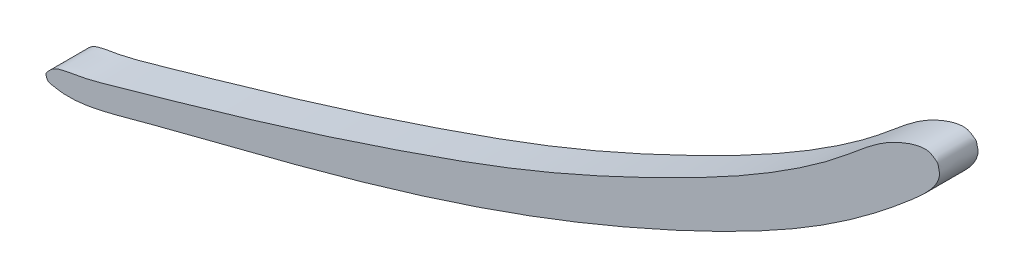
ISO-10303-21;
HEADER;
FILE_DESCRIPTION(('STEP AP214'),'2;1');
FILE_NAME('part.step','',(''),(''),'','','');
FILE_SCHEMA(('AUTOMOTIVE_DESIGN { 1 0 10303 214 1 1 1 1 }'));
ENDSEC;
DATA;
#1=APPLICATION_CONTEXT('core data for automotive mechanical design processes');
#2=APPLICATION_PROTOCOL_DEFINITION('international standard','automotive_design',2000,#1);
#3=PRODUCT_CONTEXT('',#1,'mechanical');
#4=PRODUCT('Part','Part','',(#3));
#5=PRODUCT_RELATED_PRODUCT_CATEGORY('part','',(#4));
#6=PRODUCT_DEFINITION_FORMATION('','',#4);
#7=PRODUCT_DEFINITION_CONTEXT('part definition',#1,'design');
#8=PRODUCT_DEFINITION('design','',#6,#7);
#9=PRODUCT_DEFINITION_SHAPE('','',#8);
#10=(LENGTH_UNIT() NAMED_UNIT(*) SI_UNIT(.MILLI.,.METRE.));
#11=(NAMED_UNIT(*) PLANE_ANGLE_UNIT() SI_UNIT($,.RADIAN.));
#12=(NAMED_UNIT(*) SI_UNIT($,.STERADIAN.) SOLID_ANGLE_UNIT());
#13=UNCERTAINTY_MEASURE_WITH_UNIT(LENGTH_MEASURE(1.E-05),#10,'distance_accuracy_value','');
#14=(GEOMETRIC_REPRESENTATION_CONTEXT(3) GLOBAL_UNCERTAINTY_ASSIGNED_CONTEXT((#13)) GLOBAL_UNIT_ASSIGNED_CONTEXT((#10,
#11,#12)) REPRESENTATION_CONTEXT('',''));
#15=CARTESIAN_POINT('',(0.,0.,0.));
#16=DIRECTION('',(0.,0.,1.));
#17=DIRECTION('',(1.,0.,0.));
#18=AXIS2_PLACEMENT_3D('',#15,#16,#17);
#19=CARTESIAN_POINT('',(99.1390527456377,0.,196.));
#20=CARTESIAN_POINT('',(99.0705381631852,0.12114842121631,196.));
#21=CARTESIAN_POINT('',(98.9619814801963,0.208303228285212,196.));
#22=CARTESIAN_POINT('',(98.7399154595745,0.369764675328481,196.));
#23=CARTESIAN_POINT('',(98.624108676656,0.443504908716316,196.));
#24=CARTESIAN_POINT('',(98.3964853926266,0.596828558211323,196.));
#25=CARTESIAN_POINT('',(98.2839347386924,0.675336915138092,196.));
#26=CARTESIAN_POINT('',(98.0526568526752,0.823308935798146,196.));
#27=CARTESIAN_POINT('',(97.9345351292171,0.893015556493898,196.));
#28=CARTESIAN_POINT('',(97.6931861612355,1.01937408990707,196.));
#29=CARTESIAN_POINT('',(97.569507067258,1.07560390277591,196.));
#30=CARTESIAN_POINT('',(97.3115513561695,1.16355219488391,196.));
#31=CARTESIAN_POINT('',(97.1763577467144,1.19641035513029,196.));
#32=CARTESIAN_POINT('',(96.7692919205939,1.26371098249381,196.));
#33=CARTESIAN_POINT('',(96.4967654804414,1.26860631216469,196.));
#34=CARTESIAN_POINT('',(95.950603160296,1.23980892738743,196.));
#35=CARTESIAN_POINT('',(95.6771313417599,1.20480864364403,196.));
#36=CARTESIAN_POINT('',(95.1393731928511,1.11616671398045,196.));
#37=CARTESIAN_POINT('',(94.8734792276293,1.06115150027265,196.));
#38=CARTESIAN_POINT('',(94.0836511693327,0.867969236698684,196.));
#39=CARTESIAN_POINT('',(93.5667488191588,0.704610743989481,196.));
#40=CARTESIAN_POINT('',(92.542217090791,0.34467304118778,196.));
#41=CARTESIAN_POINT('',(92.0338038993851,0.14481238472664,196.));
#42=CARTESIAN_POINT('',(91.0360529469735,-0.284285824685628,196.));
#43=CARTESIAN_POINT('',(90.5460392138195,-0.513071069627938,196.));
#44=CARTESIAN_POINT('',(89.101274263539,-1.24003238576061,196.));
#45=CARTESIAN_POINT('',(88.1727487226702,-1.78033926607219,196.));
#46=CARTESIAN_POINT('',(85.4849631288059,-3.55835843614376,196.));
#47=CARTESIAN_POINT('',(83.8137071878982,-4.93775343414661,196.));
#48=CARTESIAN_POINT('',(81.3165033570506,-7.02091526129579,196.));
#49=CARTESIAN_POINT('',(80.4840293975594,-7.71518929007293,196.));
#50=CARTESIAN_POINT('',(78.8050907139602,-9.08193828522647,196.));
#51=CARTESIAN_POINT('',(77.9593084637942,-9.75547661679078,196.));
#52=CARTESIAN_POINT('',(75.3912480991203,-11.7282366149688,196.));
#53=CARTESIAN_POINT('',(73.6410011668217,-12.983879962527,196.));
#54=CARTESIAN_POINT('',(70.091070959762,-15.4181397085281,196.));
#55=CARTESIAN_POINT('',(68.2912330143441,-16.5965151140455,196.));
#56=CARTESIAN_POINT('',(64.6538840653597,-18.8945673930191,196.));
#57=CARTESIAN_POINT('',(62.8148714639161,-20.0119046212365,196.));
#58=CARTESIAN_POINT('',(59.0983398267091,-22.1865820590974,196.));
#59=CARTESIAN_POINT('',(57.2215068059374,-23.2449911512517,196.));
#60=CARTESIAN_POINT('',(51.5477885914854,-26.3528785059766,196.));
#61=CARTESIAN_POINT('',(47.7078362833754,-28.3395620982058,196.));
#62=CARTESIAN_POINT('',(39.9704116625386,-32.2014203960084,196.));
#63=CARTESIAN_POINT('',(36.07175895946,-34.0730896522607,196.));
#64=CARTESIAN_POINT('',(28.2282382588944,-37.7117112154659,196.));
#65=CARTESIAN_POINT('',(24.2831999523126,-39.4789454757029,196.));
#66=CARTESIAN_POINT('',(16.3311017318914,-42.8746617142314,196.));
#67=CARTESIAN_POINT('',(12.3226136651517,-44.4990218988497,196.));
#68=CARTESIAN_POINT('',(4.25407820091335,-47.6041216910327,196.));
#69=CARTESIAN_POINT('',(0.193277896843264,-49.087044755674,196.));
#70=CARTESIAN_POINT('',(-7.95876247908037,-51.9726915325784,196.));
#71=CARTESIAN_POINT('',(-12.0470373785053,-53.3777358293024,196.));
#72=CARTESIAN_POINT('',(-20.2405974680925,-56.1353847275332,196.));
#73=CARTESIAN_POINT('',(-24.3468333136639,-57.4850586278146,196.));
#74=CARTESIAN_POINT('',(-32.5822485751242,-60.1136754894888,196.));
#75=CARTESIAN_POINT('',(-36.711752069253,-61.3916193754162,196.));
#76=CARTESIAN_POINT('',(-44.9902753472216,-63.8873419037721,196.));
#77=CARTESIAN_POINT('',(-49.1392940112702,-65.1050506920413,196.));
#78=CARTESIAN_POINT('',(-57.4434927727543,-67.5174173644484,196.));
#79=CARTESIAN_POINT('',(-61.5983277144829,-68.7141888448641,196.));
#80=CARTESIAN_POINT('',(-67.8337015245685,-70.4984167585606,196.));
#81=CARTESIAN_POINT('',(-69.9138974307907,-71.0870574885458,196.));
#82=CARTESIAN_POINT('',(-73.0365456983735,-71.961630498518,196.));
#83=CARTESIAN_POINT('',(-74.0768711260842,-72.2552535790516,196.));
#84=CARTESIAN_POINT('',(-76.1668281081147,-72.8074554377176,196.));
#85=CARTESIAN_POINT('',(-77.2179219237216,-73.0634705520785,196.));
#86=CARTESIAN_POINT('',(-78.8051420355843,-73.3939022545884,196.));
#87=CARTESIAN_POINT('',(-79.3358199574373,-73.4958058998055,196.));
#88=CARTESIAN_POINT('',(-80.4010711833489,-73.67960825399,196.));
#89=CARTESIAN_POINT('',(-80.935565790124,-73.7619111169165,196.));
#90=CARTESIAN_POINT('',(-81.9985156680065,-73.957532162614,196.));
#91=CARTESIAN_POINT('',(-82.5294971661545,-74.0694122656019,196.));
#92=CARTESIAN_POINT('',(-83.3040714902985,-74.2997558407684,196.));
#93=CARTESIAN_POINT('',(-83.5581101049905,-74.3879330801455,196.));
#94=CARTESIAN_POINT('',(-84.0517784498691,-74.6038279362769,196.));
#95=CARTESIAN_POINT('',(-84.2942373366876,-74.7338938915089,196.));
#96=CARTESIAN_POINT('',(-84.7337591393474,-75.0412996320327,196.));
#97=CARTESIAN_POINT('',(-84.9323319447844,-75.2187797200819,196.));
#98=CARTESIAN_POINT('',(-85.2132597996393,-75.5040001661479,196.));
#99=CARTESIAN_POINT('',(-85.3032311313982,-75.6031935549199,196.));
#100=CARTESIAN_POINT('',(-85.4819066589854,-75.8030023086123,196.));
#101=CARTESIAN_POINT('',(-85.5721858265093,-75.9026831746521,196.));
#102=CARTESIAN_POINT('',(-85.7384185263666,-76.1136617096411,196.));
#103=CARTESIAN_POINT('',(-85.8181501553151,-76.2253931021202,196.));
#104=CARTESIAN_POINT('',(-85.8959875603976,-76.4823478983223,196.));
#105=CARTESIAN_POINT('',(-85.8838544768175,-76.6219416732892,196.));
#106=CARTESIAN_POINT('',(-85.8195481192338,-76.8799306936679,196.));
#107=CARTESIAN_POINT('',(-85.7718407926133,-77.0040099671569,196.));
#108=CARTESIAN_POINT('',(-85.6655806368412,-77.2487412474883,196.));
#109=CARTESIAN_POINT('',(-85.6060904367487,-77.3696380103478,196.));
#110=CARTESIAN_POINT('',(-85.4804758142897,-77.525162716289,196.));
#111=CARTESIAN_POINT('',(-85.4324612072422,-77.5709451881218,196.));
#112=CARTESIAN_POINT('',(-85.3223635592061,-77.6478480762519,196.));
#113=CARTESIAN_POINT('',(-85.2626454776153,-77.6763087892865,196.));
#114=CARTESIAN_POINT('',(-85.0730340999229,-77.7393159789,196.));
#115=CARTESIAN_POINT('',(-84.9397110854538,-77.7557756264946,196.));
#116=CARTESIAN_POINT('',(-84.6761572344224,-77.7933237523743,196.));
#117=CARTESIAN_POINT('',(-84.5446099124298,-77.8134119438837,196.));
#118=CARTESIAN_POINT('',(-84.2827300644167,-77.8605411735858,196.));
#119=CARTESIAN_POINT('',(-84.1521300760299,-77.8859759616051,196.));
#120=CARTESIAN_POINT('',(-83.7603512343996,-77.9641713424472,196.));
#121=CARTESIAN_POINT('',(-83.4994279488752,-78.0194223044581,196.));
#122=CARTESIAN_POINT('',(-82.975670370277,-78.1072148044492,196.));
#123=CARTESIAN_POINT('',(-82.712825340275,-78.1396287503346,196.));
#124=CARTESIAN_POINT('',(-81.9217957387907,-78.2072271054569,196.));
#125=CARTESIAN_POINT('',(-81.391364946854,-78.2157185941008,196.));
#126=CARTESIAN_POINT('',(-80.327382457623,-78.1956143483966,196.));
#127=CARTESIAN_POINT('',(-79.7945140382825,-78.1665778248105,196.));
#128=CARTESIAN_POINT('',(-78.2112678098264,-78.0298553749989,196.));
#129=CARTESIAN_POINT('',(-77.1696786637489,-77.8703442286823,196.));
#130=CARTESIAN_POINT('',(-75.1027178644574,-77.4716090436837,196.));
#131=CARTESIAN_POINT('',(-74.076607646553,-77.2360152287475,196.));
#132=CARTESIAN_POINT('',(-72.0304639727079,-76.734958846878,196.));
#133=CARTESIAN_POINT('',(-71.010738012545,-76.4679848639671,196.));
#134=CARTESIAN_POINT('',(-68.9728808647812,-75.9261982060217,196.));
#135=CARTESIAN_POINT('',(-67.9550201554657,-75.6500346928756,196.));
#136=CARTESIAN_POINT('',(-65.9191599858734,-75.0987063008929,196.));
#137=CARTESIAN_POINT('',(-64.9009765795865,-74.8239846915873,196.));
#138=CARTESIAN_POINT('',(-61.8447553760793,-74.006037448587,196.));
#139=CARTESIAN_POINT('',(-59.8049142915801,-73.4695599449064,196.));
#140=CARTESIAN_POINT('',(-53.6794030174537,-71.8833326051825,196.));
#141=CARTESIAN_POINT('',(-49.588715422538,-70.8530089512087,196.));
#142=CARTESIAN_POINT('',(-41.4129848879707,-68.7707410110824,196.));
#143=CARTESIAN_POINT('',(-37.328060964298,-67.7183815568026,196.));
#144=CARTESIAN_POINT('',(-25.0987773220444,-64.4640290822007,196.));
#145=CARTESIAN_POINT('',(-16.9788494305306,-62.1689108374777,196.));
#146=CARTESIAN_POINT('',(-4.8907527487675,-58.4277005032172,196.));
#147=CARTESIAN_POINT('',(-0.875192203285054,-57.1315028451246,196.));
#148=CARTESIAN_POINT('',(7.11681195923092,-54.43187399364,196.));
#149=CARTESIAN_POINT('',(11.0934236767179,-53.0275468678937,196.));
#150=CARTESIAN_POINT('',(19.002410468593,-50.0945288405134,196.));
#151=CARTESIAN_POINT('',(22.9357583416552,-48.5655322417936,196.));
#152=CARTESIAN_POINT('',(30.7512535666687,-45.3911335824992,196.));
#153=CARTESIAN_POINT('',(34.6344408099337,-43.7459642942875,196.));
#154=CARTESIAN_POINT('',(42.3529038734393,-40.3425401538769,196.));
#155=CARTESIAN_POINT('',(46.1894902005361,-38.5847794010589,196.));
#156=CARTESIAN_POINT('',(53.7993693987408,-34.9460318210761,196.));
#157=CARTESIAN_POINT('',(57.5737071667001,-33.0649922064886,196.));
#158=CARTESIAN_POINT('',(65.0323636187695,-29.1215153018294,196.));
#159=CARTESIAN_POINT('',(68.7154629660053,-27.0596454831483,196.));
#160=CARTESIAN_POINT('',(75.918812287159,-22.6714074972758,196.));
#161=CARTESIAN_POINT('',(79.4422711321468,-20.3415132241054,196.));
#162=CARTESIAN_POINT('',(84.5644604250133,-16.6245679134496,196.));
#163=CARTESIAN_POINT('',(86.2462353260359,-15.348400505252,196.));
#164=CARTESIAN_POINT('',(89.5581059611734,-12.7329346197097,196.));
#165=CARTESIAN_POINT('',(91.190370310954,-11.3945683109664,196.));
#166=CARTESIAN_POINT('',(93.6026215180454,-9.34496116060237,196.));
#167=CARTESIAN_POINT('',(94.4011654331405,-8.65467628292653,196.));
#168=CARTESIAN_POINT('',(95.5743322114551,-7.59262629573988,196.));
#169=CARTESIAN_POINT('',(95.9602238956857,-7.23301822058665,196.));
#170=CARTESIAN_POINT('',(96.7151387980152,-6.49553711535625,196.));
#171=CARTESIAN_POINT('',(97.0846770702119,-6.1185552542365,196.));
#172=CARTESIAN_POINT('',(97.7842309875143,-5.33409030799211,196.));
#173=CARTESIAN_POINT('',(98.1149767105655,-4.92647198479069,196.));
#174=CARTESIAN_POINT('',(98.7109180534272,-4.05824119327147,196.));
#175=CARTESIAN_POINT('',(98.9749452665146,-3.59233197633501,196.));
#176=CARTESIAN_POINT('',(99.2757124496296,-2.85982825629263,196.));
#177=CARTESIAN_POINT('',(99.3614013282433,-2.60791126710274,196.));
#178=CARTESIAN_POINT('',(99.4779077142938,-2.08838729306765,196.));
#179=CARTESIAN_POINT('',(99.5091263191373,-1.82606607562914,196.));
#180=CARTESIAN_POINT('',(99.4713434581012,-1.29193630356552,196.));
#181=CARTESIAN_POINT('',(99.4007865184433,-1.03239406316814,196.));
#182=CARTESIAN_POINT('',(99.3036967444727,-0.643535638108471,196.));
#183=CARTESIAN_POINT('',(99.2771704282177,-0.512710773333086,196.));
#184=CARTESIAN_POINT('',(99.2390282127249,-0.31613329991335,196.));
#185=CARTESIAN_POINT('',(99.2268179408858,-0.250371013732544,196.));
#186=CARTESIAN_POINT('',(99.1936447923037,-0.121709051484964,196.));
#187=CARTESIAN_POINT('',(99.1733100368639,-0.0605742106081461,196.));
#188=CARTESIAN_POINT('',(99.1390527456377,0.,196.));
#189=B_SPLINE_CURVE_WITH_KNOTS('',3,(#19,#20,#21,#22,#23,#24,#25,#26,#27,#28,#29,#30,#31,#32,
#33,#34,#35,#36,#37,#38,#39,#40,#41,#42,#43,#44,#45,#46,#47,#48,#49,#50,#51,#52,#53,#54,#55,#56,
#57,#58,#59,#60,#61,#62,#63,#64,#65,#66,#67,#68,#69,#70,#71,#72,#73,#74,#75,#76,#77,#78,#79,#80,
#81,#82,#83,#84,#85,#86,#87,#88,#89,#90,#91,#92,#93,#94,#95,#96,#97,#98,#99,#100,#101,#102,#103,
#104,#105,#106,#107,#108,#109,#110,#111,#112,#113,#114,#115,#116,#117,#118,#119,#120,#121,#122,
#123,#124,#125,#126,#127,#128,#129,#130,#131,#132,#133,#134,#135,#136,#137,#138,#139,#140,#141,
#142,#143,#144,#145,#146,#147,#148,#149,#150,#151,#152,#153,#154,#155,#156,#157,#158,#159,#160,
#161,#162,#163,#164,#165,#166,#167,#168,#169,#170,#171,#172,#173,#174,#175,#176,#177,#178,#179,
#180,#181,#182,#183,#184,#185,#186,#187,#188),.UNSPECIFIED.,.T.,.F.,(4,2,2,2,2,2,2,2,2,2,2,2,2,
2,2,2,2,2,2,2,2,2,2,2,2,2,2,2,2,2,2,2,2,2,2,2,2,2,2,2,2,2,2,2,2,2,2,2,2,2,2,2,2,2,2,2,2,2,2,2,2,
2,2,2,2,2,2,2,2,2,2,2,2,2,2,2,2,2,2,2,2,2,2,2,4),(0.,0.000976562499999962,0.00195312499999992,
0.00292968749999989,0.00390624999999985,0.00488281249999981,0.00585937499999977,
0.0078124999999998,0.00976562499999982,0.0117187499999998,0.015625,0.0195312500000001,
0.0234375000000003,0.0312500000000005,0.0468750000000008,0.054687500000001,0.0625000000000012,
0.0781250000000017,0.0937500000000021,0.109375000000003,0.125000000000003,0.156250000000004,
0.187500000000005,0.218750000000006,0.250000000000006,0.281250000000007,0.312500000000008,
0.343750000000009,0.37500000000001,0.406250000000011,0.437500000000012,0.453125000000012,
0.460937500000012,0.468750000000012,0.472656250000013,0.476562500000013,0.480468750000013,
0.482421875000013,0.484375000000013,0.486328125000013,0.487304687500013,0.488281250000013,
0.489257812500013,0.490234375000013,0.491210937500013,0.492187500000013,0.492675781250013,
0.493164062500013,0.494140625000013,0.495117187500013,0.496093750000014,0.498046875000013,
0.500000000000013,0.503906250000013,0.507812500000013,0.515625000000013,0.523437500000013,
0.531250000000013,0.539062500000012,0.546875000000012,0.562500000000012,0.593750000000011,
0.62500000000001,0.687500000000008,0.718750000000007,0.750000000000006,0.781250000000005,
0.812500000000004,0.843750000000004,0.875000000000003,0.906250000000002,0.937500000000001,
0.953125000000001,0.96875,0.9765625,0.98046875,0.984375,0.98828125,0.9921875,0.994140625,
0.99609375,0.998046875,0.9990234375,0.99951171875,1.),.UNSPECIFIED.);
#190=DIRECTION('',(0.,0.,-1.));
#191=VECTOR('',#190,1.);
#192=SURFACE_OF_LINEAR_EXTRUSION('',#189,#191);
#193=CARTESIAN_POINT('',(99.1390527456377,0.,196.));
#194=CARTESIAN_POINT('',(99.1733100368639,-0.0605742106081461,196.));
#195=CARTESIAN_POINT('',(99.1936447923037,-0.121709051484964,196.));
#196=CARTESIAN_POINT('',(99.2268179408858,-0.250371013732544,196.));
#197=CARTESIAN_POINT('',(99.2390282127249,-0.31613329991335,196.));
#198=CARTESIAN_POINT('',(99.2771704282177,-0.512710773333086,196.));
#199=CARTESIAN_POINT('',(99.3036967444727,-0.643535638108471,196.));
#200=CARTESIAN_POINT('',(99.4007865184433,-1.03239406316814,196.));
#201=CARTESIAN_POINT('',(99.4713434581012,-1.29193630356552,196.));
#202=CARTESIAN_POINT('',(99.5091263191373,-1.82606607562914,196.));
#203=CARTESIAN_POINT('',(99.4779077142938,-2.08838729306765,196.));
#204=CARTESIAN_POINT('',(99.3614013282433,-2.60791126710274,196.));
#205=CARTESIAN_POINT('',(99.2757124496296,-2.85982825629263,196.));
#206=CARTESIAN_POINT('',(98.9749452665146,-3.59233197633501,196.));
#207=CARTESIAN_POINT('',(98.7109180534272,-4.05824119327147,196.));
#208=CARTESIAN_POINT('',(98.1149767105655,-4.92647198479069,196.));
#209=CARTESIAN_POINT('',(97.7842309875143,-5.33409030799211,196.));
#210=CARTESIAN_POINT('',(97.0846770702119,-6.1185552542365,196.));
#211=CARTESIAN_POINT('',(96.7151387980152,-6.49553711535625,196.));
#212=CARTESIAN_POINT('',(95.9602238956857,-7.23301822058665,196.));
#213=CARTESIAN_POINT('',(95.5743322114551,-7.59262629573988,196.));
#214=CARTESIAN_POINT('',(94.4011654331405,-8.65467628292653,196.));
#215=CARTESIAN_POINT('',(93.6026215180454,-9.34496116060237,196.));
#216=CARTESIAN_POINT('',(91.190370310954,-11.3945683109664,196.));
#217=CARTESIAN_POINT('',(89.5581059611734,-12.7329346197097,196.));
#218=CARTESIAN_POINT('',(86.2462353260359,-15.348400505252,196.));
#219=CARTESIAN_POINT('',(84.5644604250133,-16.6245679134496,196.));
#220=CARTESIAN_POINT('',(79.4422711321468,-20.3415132241054,196.));
#221=CARTESIAN_POINT('',(75.918812287159,-22.6714074972758,196.));
#222=CARTESIAN_POINT('',(68.7154629660053,-27.0596454831483,196.));
#223=CARTESIAN_POINT('',(65.0323636187695,-29.1215153018294,196.));
#224=CARTESIAN_POINT('',(57.5737071667001,-33.0649922064886,196.));
#225=CARTESIAN_POINT('',(53.7993693987408,-34.9460318210761,196.));
#226=CARTESIAN_POINT('',(46.1894902005361,-38.5847794010589,196.));
#227=CARTESIAN_POINT('',(42.3529038734393,-40.3425401538769,196.));
#228=CARTESIAN_POINT('',(34.6344408099337,-43.7459642942875,196.));
#229=CARTESIAN_POINT('',(30.7512535666687,-45.3911335824992,196.));
#230=CARTESIAN_POINT('',(22.9357583416552,-48.5655322417936,196.));
#231=CARTESIAN_POINT('',(19.002410468593,-50.0945288405134,196.));
#232=CARTESIAN_POINT('',(11.0934236767179,-53.0275468678937,196.));
#233=CARTESIAN_POINT('',(7.11681195923092,-54.43187399364,196.));
#234=CARTESIAN_POINT('',(-0.875192203285054,-57.1315028451246,196.));
#235=CARTESIAN_POINT('',(-4.8907527487675,-58.4277005032172,196.));
#236=CARTESIAN_POINT('',(-16.9788494305306,-62.1689108374777,196.));
#237=CARTESIAN_POINT('',(-25.0987773220444,-64.4640290822007,196.));
#238=CARTESIAN_POINT('',(-37.328060964298,-67.7183815568026,196.));
#239=CARTESIAN_POINT('',(-41.4129848879707,-68.7707410110824,196.));
#240=CARTESIAN_POINT('',(-49.588715422538,-70.8530089512087,196.));
#241=CARTESIAN_POINT('',(-53.6794030174537,-71.8833326051825,196.));
#242=CARTESIAN_POINT('',(-59.8049142915801,-73.4695599449064,196.));
#243=CARTESIAN_POINT('',(-61.8447553760793,-74.006037448587,196.));
#244=CARTESIAN_POINT('',(-64.9009765795865,-74.8239846915873,196.));
#245=CARTESIAN_POINT('',(-65.9191599858734,-75.0987063008929,196.));
#246=CARTESIAN_POINT('',(-67.9550201554657,-75.6500346928756,196.));
#247=CARTESIAN_POINT('',(-68.9728808647812,-75.9261982060217,196.));
#248=CARTESIAN_POINT('',(-71.010738012545,-76.4679848639671,196.));
#249=CARTESIAN_POINT('',(-72.0304639727079,-76.734958846878,196.));
#250=CARTESIAN_POINT('',(-74.076607646553,-77.2360152287475,196.));
#251=CARTESIAN_POINT('',(-75.1027178644574,-77.4716090436837,196.));
#252=CARTESIAN_POINT('',(-77.1696786637489,-77.8703442286823,196.));
#253=CARTESIAN_POINT('',(-78.2112678098264,-78.0298553749989,196.));
#254=CARTESIAN_POINT('',(-79.7945140382825,-78.1665778248105,196.));
#255=CARTESIAN_POINT('',(-80.327382457623,-78.1956143483966,196.));
#256=CARTESIAN_POINT('',(-81.391364946854,-78.2157185941008,196.));
#257=CARTESIAN_POINT('',(-81.9217957387907,-78.2072271054569,196.));
#258=CARTESIAN_POINT('',(-82.712825340275,-78.1396287503346,196.));
#259=CARTESIAN_POINT('',(-82.975670370277,-78.1072148044492,196.));
#260=CARTESIAN_POINT('',(-83.4994279488752,-78.0194223044581,196.));
#261=CARTESIAN_POINT('',(-83.7603512343996,-77.9641713424472,196.));
#262=CARTESIAN_POINT('',(-84.1521300760299,-77.8859759616051,196.));
#263=CARTESIAN_POINT('',(-84.2827300644167,-77.8605411735858,196.));
#264=CARTESIAN_POINT('',(-84.5446099124298,-77.8134119438837,196.));
#265=CARTESIAN_POINT('',(-84.6761572344224,-77.7933237523743,196.));
#266=CARTESIAN_POINT('',(-84.9397110854538,-77.7557756264946,196.));
#267=CARTESIAN_POINT('',(-85.0730340999229,-77.7393159789,196.));
#268=CARTESIAN_POINT('',(-85.2626454776153,-77.6763087892865,196.));
#269=CARTESIAN_POINT('',(-85.3223635592061,-77.6478480762519,196.));
#270=CARTESIAN_POINT('',(-85.4324612072422,-77.5709451881218,196.));
#271=CARTESIAN_POINT('',(-85.4804758142897,-77.525162716289,196.));
#272=CARTESIAN_POINT('',(-85.6060904367487,-77.3696380103478,196.));
#273=CARTESIAN_POINT('',(-85.6655806368412,-77.2487412474883,196.));
#274=CARTESIAN_POINT('',(-85.7718407926133,-77.0040099671569,196.));
#275=CARTESIAN_POINT('',(-85.8195481192338,-76.8799306936679,196.));
#276=CARTESIAN_POINT('',(-85.8838544768175,-76.6219416732892,196.));
#277=CARTESIAN_POINT('',(-85.8959875603976,-76.4823478983223,196.));
#278=CARTESIAN_POINT('',(-85.8181501553151,-76.2253931021202,196.));
#279=CARTESIAN_POINT('',(-85.7384185263666,-76.1136617096411,196.));
#280=CARTESIAN_POINT('',(-85.5721858265093,-75.9026831746521,196.));
#281=CARTESIAN_POINT('',(-85.4819066589854,-75.8030023086123,196.));
#282=CARTESIAN_POINT('',(-85.3032311313982,-75.6031935549199,196.));
#283=CARTESIAN_POINT('',(-85.2132597996393,-75.5040001661479,196.));
#284=CARTESIAN_POINT('',(-84.9323319447844,-75.2187797200819,196.));
#285=CARTESIAN_POINT('',(-84.7337591393474,-75.0412996320327,196.));
#286=CARTESIAN_POINT('',(-84.2942373366876,-74.7338938915089,196.));
#287=CARTESIAN_POINT('',(-84.0517784498691,-74.6038279362769,196.));
#288=CARTESIAN_POINT('',(-83.5581101049905,-74.3879330801455,196.));
#289=CARTESIAN_POINT('',(-83.3040714902985,-74.2997558407684,196.));
#290=CARTESIAN_POINT('',(-82.5294971661545,-74.0694122656019,196.));
#291=CARTESIAN_POINT('',(-81.9985156680065,-73.957532162614,196.));
#292=CARTESIAN_POINT('',(-80.935565790124,-73.7619111169165,196.));
#293=CARTESIAN_POINT('',(-80.4010711833489,-73.67960825399,196.));
#294=CARTESIAN_POINT('',(-79.3358199574373,-73.4958058998055,196.));
#295=CARTESIAN_POINT('',(-78.8051420355843,-73.3939022545884,196.));
#296=CARTESIAN_POINT('',(-77.2179219237216,-73.0634705520785,196.));
#297=CARTESIAN_POINT('',(-76.1668281081147,-72.8074554377176,196.));
#298=CARTESIAN_POINT('',(-74.0768711260842,-72.2552535790516,196.));
#299=CARTESIAN_POINT('',(-73.0365456983735,-71.961630498518,196.));
#300=CARTESIAN_POINT('',(-69.9138974307907,-71.0870574885458,196.));
#301=CARTESIAN_POINT('',(-67.8337015245685,-70.4984167585606,196.));
#302=CARTESIAN_POINT('',(-61.5983277144829,-68.7141888448641,196.));
#303=CARTESIAN_POINT('',(-57.4434927727543,-67.5174173644484,196.));
#304=CARTESIAN_POINT('',(-49.1392940112702,-65.1050506920413,196.));
#305=CARTESIAN_POINT('',(-44.9902753472216,-63.8873419037721,196.));
#306=CARTESIAN_POINT('',(-36.711752069253,-61.3916193754162,196.));
#307=CARTESIAN_POINT('',(-32.5822485751242,-60.1136754894888,196.));
#308=CARTESIAN_POINT('',(-24.3468333136639,-57.4850586278146,196.));
#309=CARTESIAN_POINT('',(-20.2405974680925,-56.1353847275332,196.));
#310=CARTESIAN_POINT('',(-12.0470373785053,-53.3777358293024,196.));
#311=CARTESIAN_POINT('',(-7.95876247908037,-51.9726915325784,196.));
#312=CARTESIAN_POINT('',(0.193277896843264,-49.087044755674,196.));
#313=CARTESIAN_POINT('',(4.25407820091335,-47.6041216910327,196.));
#314=CARTESIAN_POINT('',(12.3226136651517,-44.4990218988497,196.));
#315=CARTESIAN_POINT('',(16.3311017318914,-42.8746617142314,196.));
#316=CARTESIAN_POINT('',(24.2831999523126,-39.4789454757029,196.));
#317=CARTESIAN_POINT('',(28.2282382588944,-37.7117112154659,196.));
#318=CARTESIAN_POINT('',(36.07175895946,-34.0730896522607,196.));
#319=CARTESIAN_POINT('',(39.9704116625386,-32.2014203960084,196.));
#320=CARTESIAN_POINT('',(47.7078362833754,-28.3395620982058,196.));
#321=CARTESIAN_POINT('',(51.5477885914854,-26.3528785059766,196.));
#322=CARTESIAN_POINT('',(57.2215068059374,-23.2449911512517,196.));
#323=CARTESIAN_POINT('',(59.0983398267091,-22.1865820590974,196.));
#324=CARTESIAN_POINT('',(62.8148714639161,-20.0119046212365,196.));
#325=CARTESIAN_POINT('',(64.6538840653597,-18.8945673930191,196.));
#326=CARTESIAN_POINT('',(68.2912330143441,-16.5965151140455,196.));
#327=CARTESIAN_POINT('',(70.091070959762,-15.4181397085281,196.));
#328=CARTESIAN_POINT('',(73.6410011668217,-12.983879962527,196.));
#329=CARTESIAN_POINT('',(75.3912480991203,-11.7282366149688,196.));
#330=CARTESIAN_POINT('',(77.9593084637942,-9.75547661679078,196.));
#331=CARTESIAN_POINT('',(78.8050907139602,-9.08193828522647,196.));
#332=CARTESIAN_POINT('',(80.4840293975594,-7.71518929007293,196.));
#333=CARTESIAN_POINT('',(81.3165033570506,-7.02091526129579,196.));
#334=CARTESIAN_POINT('',(83.8137071878982,-4.93775343414661,196.));
#335=CARTESIAN_POINT('',(85.4849631288059,-3.55835843614376,196.));
#336=CARTESIAN_POINT('',(88.1727487226702,-1.78033926607219,196.));
#337=CARTESIAN_POINT('',(89.101274263539,-1.24003238576061,196.));
#338=CARTESIAN_POINT('',(90.5460392138195,-0.513071069627938,196.));
#339=CARTESIAN_POINT('',(91.0360529469735,-0.284285824685628,196.));
#340=CARTESIAN_POINT('',(92.0338038993851,0.14481238472664,196.));
#341=CARTESIAN_POINT('',(92.542217090791,0.34467304118778,196.));
#342=CARTESIAN_POINT('',(93.5667488191588,0.704610743989481,196.));
#343=CARTESIAN_POINT('',(94.0836511693327,0.867969236698684,196.));
#344=CARTESIAN_POINT('',(94.8734792276293,1.06115150027265,196.));
#345=CARTESIAN_POINT('',(95.1393731928511,1.11616671398045,196.));
#346=CARTESIAN_POINT('',(95.6771313417599,1.20480864364403,196.));
#347=CARTESIAN_POINT('',(95.950603160296,1.23980892738743,196.));
#348=CARTESIAN_POINT('',(96.4967654804414,1.26860631216469,196.));
#349=CARTESIAN_POINT('',(96.7692919205939,1.26371098249381,196.));
#350=CARTESIAN_POINT('',(97.1763577467144,1.19641035513029,196.));
#351=CARTESIAN_POINT('',(97.3115513561695,1.16355219488391,196.));
#352=CARTESIAN_POINT('',(97.569507067258,1.07560390277591,196.));
#353=CARTESIAN_POINT('',(97.6931861612355,1.01937408990707,196.));
#354=CARTESIAN_POINT('',(97.9345351292171,0.893015556493898,196.));
#355=CARTESIAN_POINT('',(98.0526568526752,0.823308935798146,196.));
#356=CARTESIAN_POINT('',(98.2839347386924,0.675336915138092,196.));
#357=CARTESIAN_POINT('',(98.3964853926266,0.596828558211323,196.));
#358=CARTESIAN_POINT('',(98.624108676656,0.443504908716316,196.));
#359=CARTESIAN_POINT('',(98.7399154595745,0.369764675328481,196.));
#360=CARTESIAN_POINT('',(98.9619814801963,0.208303228285212,196.));
#361=CARTESIAN_POINT('',(99.0705381631852,0.12114842121631,196.));
#362=CARTESIAN_POINT('',(99.1390527456377,0.,196.));
#363=B_SPLINE_CURVE_WITH_KNOTS('',3,(#193,#194,#195,#196,#197,#198,#199,#200,#201,#202,#203,
#204,#205,#206,#207,#208,#209,#210,#211,#212,#213,#214,#215,#216,#217,#218,#219,#220,#221,#222,
#223,#224,#225,#226,#227,#228,#229,#230,#231,#232,#233,#234,#235,#236,#237,#238,#239,#240,#241,
#242,#243,#244,#245,#246,#247,#248,#249,#250,#251,#252,#253,#254,#255,#256,#257,#258,#259,#260,
#261,#262,#263,#264,#265,#266,#267,#268,#269,#270,#271,#272,#273,#274,#275,#276,#277,#278,#279,
#280,#281,#282,#283,#284,#285,#286,#287,#288,#289,#290,#291,#292,#293,#294,#295,#296,#297,#298,
#299,#300,#301,#302,#303,#304,#305,#306,#307,#308,#309,#310,#311,#312,#313,#314,#315,#316,#317,
#318,#319,#320,#321,#322,#323,#324,#325,#326,#327,#328,#329,#330,#331,#332,#333,#334,#335,#336,
#337,#338,#339,#340,#341,#342,#343,#344,#345,#346,#347,#348,#349,#350,#351,#352,#353,#354,#355,
#356,#357,#358,#359,#360,#361,#362),.UNSPECIFIED.,.T.,.F.,(4,2,2,2,2,2,2,2,2,2,2,2,2,2,2,2,2,2,
2,2,2,2,2,2,2,2,2,2,2,2,2,2,2,2,2,2,2,2,2,2,2,2,2,2,2,2,2,2,2,2,2,2,2,2,2,2,2,2,2,2,2,2,2,2,2,2,
2,2,2,2,2,2,2,2,2,2,2,2,2,2,2,2,2,2,4),(0.,0.000488281250000111,0.000976562500000111,
0.001953125,0.00390625000000011,0.00585937500000011,0.00781250000000011,0.0117187500000001,
0.0156250000000001,0.01953125,0.0234375,0.0312499999999998,0.0468749999999994,0.062499999999999,
0.0937499999999982,0.124999999999997,0.156249999999996,0.187499999999996,0.218749999999995,
0.249999999999994,0.281249999999993,0.312499999999992,0.37499999999999,0.406249999999989,
0.437499999999988,0.453124999999988,0.460937499999988,0.468749999999987,0.476562499999987,
0.484374999999987,0.492187499999987,0.496093749999987,0.499999999999987,0.501953124999987,
0.503906249999986,0.504882812499986,0.505859374999986,0.506835937499986,0.507324218749986,
0.507812499999986,0.508789062499987,0.509765624999987,0.510742187499987,0.511718749999987,
0.512695312499987,0.513671874999987,0.515624999999987,0.517578124999987,0.519531249999987,
0.523437499999987,0.527343749999987,0.531249999999988,0.539062499999988,0.546874999999988,
0.562499999999988,0.593749999999989,0.62499999999999,0.656249999999991,0.687499999999992,
0.718749999999993,0.749999999999994,0.781249999999994,0.812499999999995,0.843749999999996,
0.874999999999997,0.890624999999997,0.906249999999998,0.921874999999998,0.937499999999999,
0.945312499999999,0.953124999999999,0.96875,0.9765625,0.98046875,0.984375,0.98828125,
0.990234375,0.9921875,0.994140625,0.9951171875,0.99609375,0.9970703125,0.998046875,0.9990234375,
1.),.UNSPECIFIED.);
#364=CARTESIAN_POINT('',(99.1390527456377,0.,196.));
#365=VERTEX_POINT('',#364);
#366=EDGE_CURVE('E10',#365,#365,#363,.F.);
#367=ORIENTED_EDGE('',*,*,#366,.F.);
#368=EDGE_LOOP('',(#367));
#369=FACE_BOUND('',#368,.T.);
#370=CARTESIAN_POINT('',(99.1390527456377,0.,188.));
#371=CARTESIAN_POINT('',(99.0705381631852,0.12114842121631,188.));
#372=CARTESIAN_POINT('',(98.9619814801963,0.208303228285212,188.));
#373=CARTESIAN_POINT('',(98.7399154595745,0.369764675328481,188.));
#374=CARTESIAN_POINT('',(98.624108676656,0.443504908716316,188.));
#375=CARTESIAN_POINT('',(98.3964853926266,0.596828558211323,188.));
#376=CARTESIAN_POINT('',(98.2839347386924,0.675336915138092,188.));
#377=CARTESIAN_POINT('',(98.0526568526752,0.823308935798146,188.));
#378=CARTESIAN_POINT('',(97.9345351292171,0.893015556493898,188.));
#379=CARTESIAN_POINT('',(97.6931861612355,1.01937408990707,188.));
#380=CARTESIAN_POINT('',(97.569507067258,1.07560390277591,188.));
#381=CARTESIAN_POINT('',(97.3115513561695,1.16355219488391,188.));
#382=CARTESIAN_POINT('',(97.1763577467144,1.19641035513029,188.));
#383=CARTESIAN_POINT('',(96.7692919205939,1.26371098249381,188.));
#384=CARTESIAN_POINT('',(96.4967654804414,1.26860631216469,188.));
#385=CARTESIAN_POINT('',(95.950603160296,1.23980892738743,188.));
#386=CARTESIAN_POINT('',(95.6771313417599,1.20480864364403,188.));
#387=CARTESIAN_POINT('',(95.1393731928511,1.11616671398045,188.));
#388=CARTESIAN_POINT('',(94.8734792276293,1.06115150027265,188.));
#389=CARTESIAN_POINT('',(94.0836511693327,0.867969236698684,188.));
#390=CARTESIAN_POINT('',(93.5667488191588,0.704610743989481,188.));
#391=CARTESIAN_POINT('',(92.542217090791,0.34467304118778,188.));
#392=CARTESIAN_POINT('',(92.0338038993851,0.14481238472664,188.));
#393=CARTESIAN_POINT('',(91.0360529469735,-0.284285824685628,188.));
#394=CARTESIAN_POINT('',(90.5460392138195,-0.513071069627938,188.));
#395=CARTESIAN_POINT('',(89.101274263539,-1.24003238576061,188.));
#396=CARTESIAN_POINT('',(88.1727487226702,-1.78033926607219,188.));
#397=CARTESIAN_POINT('',(85.4849631288059,-3.55835843614376,188.));
#398=CARTESIAN_POINT('',(83.8137071878982,-4.93775343414661,188.));
#399=CARTESIAN_POINT('',(81.3165033570506,-7.02091526129579,188.));
#400=CARTESIAN_POINT('',(80.4840293975594,-7.71518929007293,188.));
#401=CARTESIAN_POINT('',(78.8050907139602,-9.08193828522647,188.));
#402=CARTESIAN_POINT('',(77.9593084637942,-9.75547661679078,188.));
#403=CARTESIAN_POINT('',(75.3912480991203,-11.7282366149688,188.));
#404=CARTESIAN_POINT('',(73.6410011668217,-12.983879962527,188.));
#405=CARTESIAN_POINT('',(70.091070959762,-15.4181397085281,188.));
#406=CARTESIAN_POINT('',(68.2912330143441,-16.5965151140455,188.));
#407=CARTESIAN_POINT('',(64.6538840653597,-18.8945673930191,188.));
#408=CARTESIAN_POINT('',(62.8148714639161,-20.0119046212365,188.));
#409=CARTESIAN_POINT('',(59.0983398267091,-22.1865820590974,188.));
#410=CARTESIAN_POINT('',(57.2215068059374,-23.2449911512517,188.));
#411=CARTESIAN_POINT('',(51.5477885914854,-26.3528785059766,188.));
#412=CARTESIAN_POINT('',(47.7078362833754,-28.3395620982058,188.));
#413=CARTESIAN_POINT('',(39.9704116625386,-32.2014203960084,188.));
#414=CARTESIAN_POINT('',(36.07175895946,-34.0730896522607,188.));
#415=CARTESIAN_POINT('',(28.2282382588944,-37.7117112154659,188.));
#416=CARTESIAN_POINT('',(24.2831999523126,-39.4789454757029,188.));
#417=CARTESIAN_POINT('',(16.3311017318914,-42.8746617142314,188.));
#418=CARTESIAN_POINT('',(12.3226136651517,-44.4990218988497,188.));
#419=CARTESIAN_POINT('',(4.25407820091335,-47.6041216910327,188.));
#420=CARTESIAN_POINT('',(0.193277896843264,-49.087044755674,188.));
#421=CARTESIAN_POINT('',(-7.95876247908037,-51.9726915325784,188.));
#422=CARTESIAN_POINT('',(-12.0470373785053,-53.3777358293024,188.));
#423=CARTESIAN_POINT('',(-20.2405974680925,-56.1353847275332,188.));
#424=CARTESIAN_POINT('',(-24.3468333136639,-57.4850586278146,188.));
#425=CARTESIAN_POINT('',(-32.5822485751242,-60.1136754894888,188.));
#426=CARTESIAN_POINT('',(-36.711752069253,-61.3916193754162,188.));
#427=CARTESIAN_POINT('',(-44.9902753472216,-63.8873419037721,188.));
#428=CARTESIAN_POINT('',(-49.1392940112702,-65.1050506920413,188.));
#429=CARTESIAN_POINT('',(-57.4434927727543,-67.5174173644484,188.));
#430=CARTESIAN_POINT('',(-61.5983277144829,-68.7141888448641,188.));
#431=CARTESIAN_POINT('',(-67.8337015245685,-70.4984167585606,188.));
#432=CARTESIAN_POINT('',(-69.9138974307907,-71.0870574885458,188.));
#433=CARTESIAN_POINT('',(-73.0365456983735,-71.961630498518,188.));
#434=CARTESIAN_POINT('',(-74.0768711260842,-72.2552535790516,188.));
#435=CARTESIAN_POINT('',(-76.1668281081147,-72.8074554377176,188.));
#436=CARTESIAN_POINT('',(-77.2179219237216,-73.0634705520785,188.));
#437=CARTESIAN_POINT('',(-78.8051420355843,-73.3939022545884,188.));
#438=CARTESIAN_POINT('',(-79.3358199574373,-73.4958058998055,188.));
#439=CARTESIAN_POINT('',(-80.4010711833489,-73.67960825399,188.));
#440=CARTESIAN_POINT('',(-80.935565790124,-73.7619111169165,188.));
#441=CARTESIAN_POINT('',(-81.9985156680065,-73.957532162614,188.));
#442=CARTESIAN_POINT('',(-82.5294971661545,-74.0694122656019,188.));
#443=CARTESIAN_POINT('',(-83.3040714902985,-74.2997558407684,188.));
#444=CARTESIAN_POINT('',(-83.5581101049905,-74.3879330801455,188.));
#445=CARTESIAN_POINT('',(-84.0517784498691,-74.6038279362769,188.));
#446=CARTESIAN_POINT('',(-84.2942373366876,-74.7338938915089,188.));
#447=CARTESIAN_POINT('',(-84.7337591393474,-75.0412996320327,188.));
#448=CARTESIAN_POINT('',(-84.9323319447844,-75.2187797200819,188.));
#449=CARTESIAN_POINT('',(-85.2132597996393,-75.5040001661479,188.));
#450=CARTESIAN_POINT('',(-85.3032311313982,-75.6031935549199,188.));
#451=CARTESIAN_POINT('',(-85.4819066589854,-75.8030023086123,188.));
#452=CARTESIAN_POINT('',(-85.5721858265093,-75.9026831746521,188.));
#453=CARTESIAN_POINT('',(-85.7384185263666,-76.1136617096411,188.));
#454=CARTESIAN_POINT('',(-85.8181501553151,-76.2253931021202,188.));
#455=CARTESIAN_POINT('',(-85.8959875603976,-76.4823478983223,188.));
#456=CARTESIAN_POINT('',(-85.8838544768175,-76.6219416732892,188.));
#457=CARTESIAN_POINT('',(-85.8195481192338,-76.8799306936679,188.));
#458=CARTESIAN_POINT('',(-85.7718407926133,-77.0040099671569,188.));
#459=CARTESIAN_POINT('',(-85.6655806368412,-77.2487412474883,188.));
#460=CARTESIAN_POINT('',(-85.6060904367487,-77.3696380103478,188.));
#461=CARTESIAN_POINT('',(-85.4804758142897,-77.525162716289,188.));
#462=CARTESIAN_POINT('',(-85.4324612072422,-77.5709451881218,188.));
#463=CARTESIAN_POINT('',(-85.3223635592061,-77.6478480762519,188.));
#464=CARTESIAN_POINT('',(-85.2626454776153,-77.6763087892865,188.));
#465=CARTESIAN_POINT('',(-85.0730340999229,-77.7393159789,188.));
#466=CARTESIAN_POINT('',(-84.9397110854538,-77.7557756264946,188.));
#467=CARTESIAN_POINT('',(-84.6761572344224,-77.7933237523743,188.));
#468=CARTESIAN_POINT('',(-84.5446099124298,-77.8134119438837,188.));
#469=CARTESIAN_POINT('',(-84.2827300644167,-77.8605411735858,188.));
#470=CARTESIAN_POINT('',(-84.1521300760299,-77.8859759616051,188.));
#471=CARTESIAN_POINT('',(-83.7603512343996,-77.9641713424472,188.));
#472=CARTESIAN_POINT('',(-83.4994279488752,-78.0194223044581,188.));
#473=CARTESIAN_POINT('',(-82.975670370277,-78.1072148044492,188.));
#474=CARTESIAN_POINT('',(-82.712825340275,-78.1396287503346,188.));
#475=CARTESIAN_POINT('',(-81.9217957387907,-78.2072271054569,188.));
#476=CARTESIAN_POINT('',(-81.391364946854,-78.2157185941008,188.));
#477=CARTESIAN_POINT('',(-80.327382457623,-78.1956143483966,188.));
#478=CARTESIAN_POINT('',(-79.7945140382825,-78.1665778248105,188.));
#479=CARTESIAN_POINT('',(-78.2112678098264,-78.0298553749989,188.));
#480=CARTESIAN_POINT('',(-77.1696786637489,-77.8703442286823,188.));
#481=CARTESIAN_POINT('',(-75.1027178644574,-77.4716090436837,188.));
#482=CARTESIAN_POINT('',(-74.076607646553,-77.2360152287475,188.));
#483=CARTESIAN_POINT('',(-72.0304639727079,-76.734958846878,188.));
#484=CARTESIAN_POINT('',(-71.010738012545,-76.4679848639671,188.));
#485=CARTESIAN_POINT('',(-68.9728808647812,-75.9261982060217,188.));
#486=CARTESIAN_POINT('',(-67.9550201554657,-75.6500346928756,188.));
#487=CARTESIAN_POINT('',(-65.9191599858734,-75.0987063008929,188.));
#488=CARTESIAN_POINT('',(-64.9009765795865,-74.8239846915873,188.));
#489=CARTESIAN_POINT('',(-61.8447553760793,-74.006037448587,188.));
#490=CARTESIAN_POINT('',(-59.8049142915801,-73.4695599449064,188.));
#491=CARTESIAN_POINT('',(-53.6794030174537,-71.8833326051825,188.));
#492=CARTESIAN_POINT('',(-49.588715422538,-70.8530089512087,188.));
#493=CARTESIAN_POINT('',(-41.4129848879707,-68.7707410110824,188.));
#494=CARTESIAN_POINT('',(-37.328060964298,-67.7183815568026,188.));
#495=CARTESIAN_POINT('',(-25.0987773220444,-64.4640290822007,188.));
#496=CARTESIAN_POINT('',(-16.9788494305306,-62.1689108374777,188.));
#497=CARTESIAN_POINT('',(-4.8907527487675,-58.4277005032172,188.));
#498=CARTESIAN_POINT('',(-0.875192203285054,-57.1315028451246,188.));
#499=CARTESIAN_POINT('',(7.11681195923092,-54.43187399364,188.));
#500=CARTESIAN_POINT('',(11.0934236767179,-53.0275468678937,188.));
#501=CARTESIAN_POINT('',(19.002410468593,-50.0945288405134,188.));
#502=CARTESIAN_POINT('',(22.9357583416552,-48.5655322417936,188.));
#503=CARTESIAN_POINT('',(30.7512535666687,-45.3911335824992,188.));
#504=CARTESIAN_POINT('',(34.6344408099337,-43.7459642942875,188.));
#505=CARTESIAN_POINT('',(42.3529038734393,-40.3425401538769,188.));
#506=CARTESIAN_POINT('',(46.1894902005361,-38.5847794010589,188.));
#507=CARTESIAN_POINT('',(53.7993693987408,-34.9460318210761,188.));
#508=CARTESIAN_POINT('',(57.5737071667001,-33.0649922064886,188.));
#509=CARTESIAN_POINT('',(65.0323636187695,-29.1215153018294,188.));
#510=CARTESIAN_POINT('',(68.7154629660053,-27.0596454831483,188.));
#511=CARTESIAN_POINT('',(75.918812287159,-22.6714074972758,188.));
#512=CARTESIAN_POINT('',(79.4422711321468,-20.3415132241054,188.));
#513=CARTESIAN_POINT('',(84.5644604250133,-16.6245679134496,188.));
#514=CARTESIAN_POINT('',(86.2462353260359,-15.348400505252,188.));
#515=CARTESIAN_POINT('',(89.5581059611734,-12.7329346197097,188.));
#516=CARTESIAN_POINT('',(91.190370310954,-11.3945683109664,188.));
#517=CARTESIAN_POINT('',(93.6026215180454,-9.34496116060237,188.));
#518=CARTESIAN_POINT('',(94.4011654331405,-8.65467628292653,188.));
#519=CARTESIAN_POINT('',(95.5743322114551,-7.59262629573988,188.));
#520=CARTESIAN_POINT('',(95.9602238956857,-7.23301822058665,188.));
#521=CARTESIAN_POINT('',(96.7151387980152,-6.49553711535625,188.));
#522=CARTESIAN_POINT('',(97.0846770702119,-6.1185552542365,188.));
#523=CARTESIAN_POINT('',(97.7842309875143,-5.33409030799211,188.));
#524=CARTESIAN_POINT('',(98.1149767105655,-4.92647198479069,188.));
#525=CARTESIAN_POINT('',(98.7109180534272,-4.05824119327147,188.));
#526=CARTESIAN_POINT('',(98.9749452665146,-3.59233197633501,188.));
#527=CARTESIAN_POINT('',(99.2757124496296,-2.85982825629263,188.));
#528=CARTESIAN_POINT('',(99.3614013282433,-2.60791126710274,188.));
#529=CARTESIAN_POINT('',(99.4779077142938,-2.08838729306765,188.));
#530=CARTESIAN_POINT('',(99.5091263191373,-1.82606607562914,188.));
#531=CARTESIAN_POINT('',(99.4713434581012,-1.29193630356552,188.));
#532=CARTESIAN_POINT('',(99.4007865184433,-1.03239406316814,188.));
#533=CARTESIAN_POINT('',(99.3036967444727,-0.643535638108471,188.));
#534=CARTESIAN_POINT('',(99.2771704282177,-0.512710773333086,188.));
#535=CARTESIAN_POINT('',(99.2390282127249,-0.31613329991335,188.));
#536=CARTESIAN_POINT('',(99.2268179408858,-0.250371013732544,188.));
#537=CARTESIAN_POINT('',(99.1936447923037,-0.121709051484964,188.));
#538=CARTESIAN_POINT('',(99.1733100368639,-0.0605742106081461,188.));
#539=CARTESIAN_POINT('',(99.1390527456377,0.,188.));
#540=B_SPLINE_CURVE_WITH_KNOTS('',3,(#370,#371,#372,#373,#374,#375,#376,#377,#378,#379,#380,
#381,#382,#383,#384,#385,#386,#387,#388,#389,#390,#391,#392,#393,#394,#395,#396,#397,#398,#399,
#400,#401,#402,#403,#404,#405,#406,#407,#408,#409,#410,#411,#412,#413,#414,#415,#416,#417,#418,
#419,#420,#421,#422,#423,#424,#425,#426,#427,#428,#429,#430,#431,#432,#433,#434,#435,#436,#437,
#438,#439,#440,#441,#442,#443,#444,#445,#446,#447,#448,#449,#450,#451,#452,#453,#454,#455,#456,
#457,#458,#459,#460,#461,#462,#463,#464,#465,#466,#467,#468,#469,#470,#471,#472,#473,#474,#475,
#476,#477,#478,#479,#480,#481,#482,#483,#484,#485,#486,#487,#488,#489,#490,#491,#492,#493,#494,
#495,#496,#497,#498,#499,#500,#501,#502,#503,#504,#505,#506,#507,#508,#509,#510,#511,#512,#513,
#514,#515,#516,#517,#518,#519,#520,#521,#522,#523,#524,#525,#526,#527,#528,#529,#530,#531,#532,
#533,#534,#535,#536,#537,#538,#539),.UNSPECIFIED.,.T.,.F.,(4,2,2,2,2,2,2,2,2,2,2,2,2,2,2,2,2,2,
2,2,2,2,2,2,2,2,2,2,2,2,2,2,2,2,2,2,2,2,2,2,2,2,2,2,2,2,2,2,2,2,2,2,2,2,2,2,2,2,2,2,2,2,2,2,2,2,
2,2,2,2,2,2,2,2,2,2,2,2,2,2,2,2,2,2,4),(0.,0.000976562499999962,0.00195312499999992,
0.00292968749999989,0.00390624999999985,0.00488281249999981,0.00585937499999977,
0.0078124999999998,0.00976562499999982,0.0117187499999998,0.015625,0.0195312500000001,
0.0234375000000003,0.0312500000000005,0.0468750000000008,0.054687500000001,0.0625000000000012,
0.0781250000000017,0.0937500000000021,0.109375000000003,0.125000000000003,0.156250000000004,
0.187500000000005,0.218750000000006,0.250000000000006,0.281250000000007,0.312500000000008,
0.343750000000009,0.37500000000001,0.406250000000011,0.437500000000012,0.453125000000012,
0.460937500000012,0.468750000000012,0.472656250000013,0.476562500000013,0.480468750000013,
0.482421875000013,0.484375000000013,0.486328125000013,0.487304687500013,0.488281250000013,
0.489257812500013,0.490234375000013,0.491210937500013,0.492187500000013,0.492675781250013,
0.493164062500013,0.494140625000013,0.495117187500013,0.496093750000014,0.498046875000013,
0.500000000000013,0.503906250000013,0.507812500000013,0.515625000000013,0.523437500000013,
0.531250000000013,0.539062500000012,0.546875000000012,0.562500000000012,0.593750000000011,
0.62500000000001,0.687500000000008,0.718750000000007,0.750000000000006,0.781250000000005,
0.812500000000004,0.843750000000004,0.875000000000003,0.906250000000002,0.937500000000001,
0.953125000000001,0.96875,0.9765625,0.98046875,0.984375,0.98828125,0.9921875,0.994140625,
0.99609375,0.998046875,0.9990234375,0.99951171875,1.),.UNSPECIFIED.);
#541=CARTESIAN_POINT('',(99.1390527456377,0.,188.));
#542=VERTEX_POINT('',#541);
#543=EDGE_CURVE('E38',#542,#542,#540,.T.);
#544=ORIENTED_EDGE('',*,*,#543,.T.);
#545=EDGE_LOOP('',(#544));
#546=FACE_BOUND('',#545,.T.);
#547=ADVANCED_FACE('F28',(#369,#546),#192,.F.);
#548=CARTESIAN_POINT('',(-82.4491488064524,-78.1621615353749,196.));
#549=DIRECTION('',(0.,0.,-1.));
#550=DIRECTION('',(-1.,0.,0.));
#551=AXIS2_PLACEMENT_3D('',#548,#549,#550);
#552=PLANE('',#551);
#553=ORIENTED_EDGE('',*,*,#366,.T.);
#554=EDGE_LOOP('',(#553));
#555=FACE_BOUND('',#554,.T.);
#556=ADVANCED_FACE('F69',(#555),#552,.F.);
#557=CARTESIAN_POINT('',(-82.4491488064524,-78.1621615353749,188.));
#558=DIRECTION('',(0.,0.,-1.));
#559=DIRECTION('',(-1.,0.,0.));
#560=AXIS2_PLACEMENT_3D('',#557,#558,#559);
#561=PLANE('',#560);
#562=ORIENTED_EDGE('',*,*,#543,.F.);
#563=EDGE_LOOP('',(#562));
#564=FACE_BOUND('',#563,.T.);
#565=ADVANCED_FACE('F77',(#564),#561,.T.);
#566=CLOSED_SHELL('',(#547,#556,#565));
#567=MANIFOLD_SOLID_BREP('B2',#566);
#568=ADVANCED_BREP_SHAPE_REPRESENTATION('',(#18,#567),#14);
#569=SHAPE_DEFINITION_REPRESENTATION(#9,#568);
ENDSEC;
END-ISO-10303-21;
